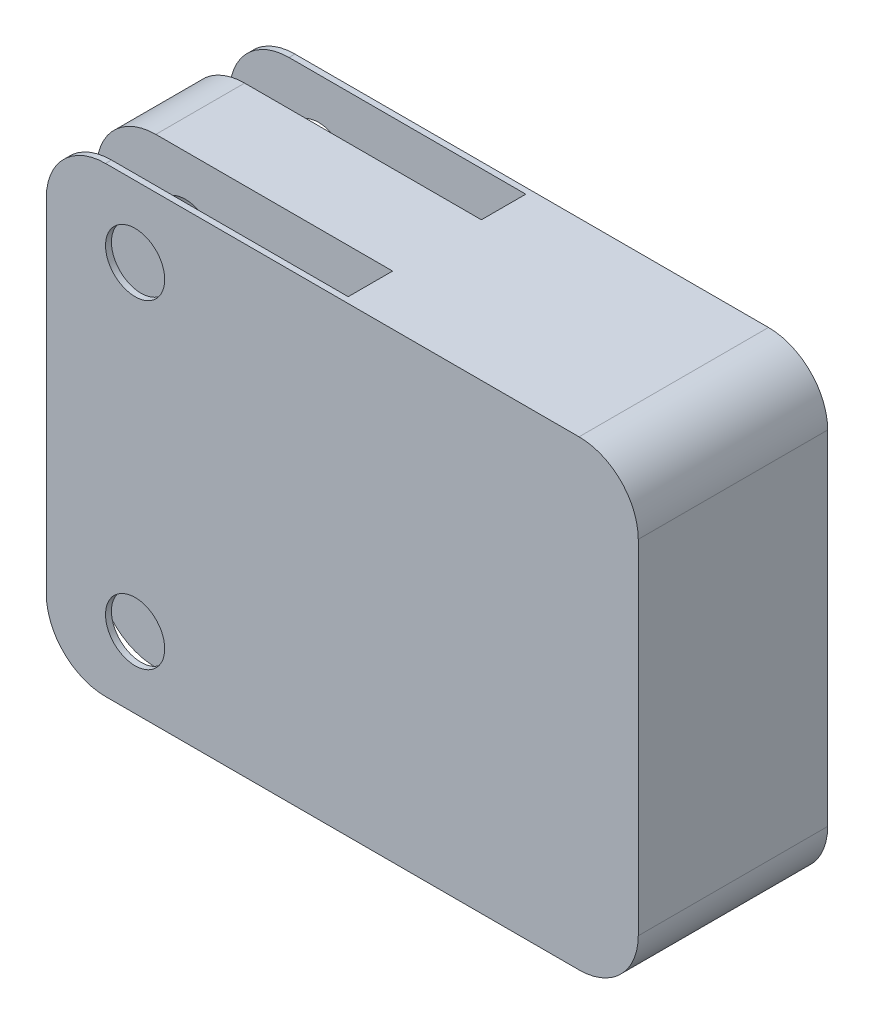
ISO-10303-21;
HEADER;
FILE_DESCRIPTION(('STEP AP214'),'2;1');
FILE_NAME('part.step','',(''),(''),'','','');
FILE_SCHEMA(('AUTOMOTIVE_DESIGN { 1 0 10303 214 1 1 1 1 }'));
ENDSEC;
DATA;
#1=APPLICATION_CONTEXT('core data for automotive mechanical design processes');
#2=APPLICATION_PROTOCOL_DEFINITION('international standard','automotive_design',2000,#1);
#3=PRODUCT_CONTEXT('',#1,'mechanical');
#4=PRODUCT('Part','Part','',(#3));
#5=PRODUCT_RELATED_PRODUCT_CATEGORY('part','',(#4));
#6=PRODUCT_DEFINITION_FORMATION('','',#4);
#7=PRODUCT_DEFINITION_CONTEXT('part definition',#1,'design');
#8=PRODUCT_DEFINITION('design','',#6,#7);
#9=PRODUCT_DEFINITION_SHAPE('','',#8);
#10=(LENGTH_UNIT() NAMED_UNIT(*) SI_UNIT(.MILLI.,.METRE.));
#11=(NAMED_UNIT(*) PLANE_ANGLE_UNIT() SI_UNIT($,.RADIAN.));
#12=(NAMED_UNIT(*) SI_UNIT($,.STERADIAN.) SOLID_ANGLE_UNIT());
#13=UNCERTAINTY_MEASURE_WITH_UNIT(LENGTH_MEASURE(1.E-05),#10,'distance_accuracy_value','');
#14=(GEOMETRIC_REPRESENTATION_CONTEXT(3) GLOBAL_UNCERTAINTY_ASSIGNED_CONTEXT((#13)) GLOBAL_UNIT_ASSIGNED_CONTEXT((#10,
#11,#12)) REPRESENTATION_CONTEXT('',''));
#15=CARTESIAN_POINT('',(0.,0.,0.));
#16=DIRECTION('',(0.,0.,1.));
#17=DIRECTION('',(1.,0.,0.));
#18=AXIS2_PLACEMENT_3D('',#15,#16,#17);
#19=CARTESIAN_POINT('',(0.,0.,15.));
#20=DIRECTION('',(0.,0.,1.));
#21=DIRECTION('',(1.,0.,0.));
#22=AXIS2_PLACEMENT_3D('',#19,#20,#21);
#23=PLANE('',#22);
#24=CARTESIAN_POINT('',(-40.,-27.,15.));
#25=DIRECTION('',(0.,0.,1.));
#26=DIRECTION('',(1.,0.,0.));
#27=AXIS2_PLACEMENT_3D('',#24,#25,#26);
#28=CIRCLE('',#27,5.);
#29=CARTESIAN_POINT('',(-35.,-27.,15.));
#30=VERTEX_POINT('',#29);
#31=EDGE_CURVE('E230',#30,#30,#28,.T.);
#32=ORIENTED_EDGE('',*,*,#31,.F.);
#33=EDGE_LOOP('',(#32));
#34=FACE_BOUND('',#33,.T.);
#35=CARTESIAN_POINT('',(-40.,27.,15.));
#36=DIRECTION('',(0.,0.,1.));
#37=DIRECTION('',(-1.,0.,0.));
#38=AXIS2_PLACEMENT_3D('',#35,#36,#37);
#39=CIRCLE('',#38,4.99999999999999);
#40=CARTESIAN_POINT('',(-45.,27.,15.));
#41=VERTEX_POINT('',#40);
#42=EDGE_CURVE('E222',#41,#41,#39,.T.);
#43=ORIENTED_EDGE('',*,*,#42,.F.);
#44=EDGE_LOOP('',(#43));
#45=FACE_BOUND('',#44,.T.);
#46=DIRECTION('',(1.,0.,0.));
#47=VECTOR('',#46,1.);
#48=CARTESIAN_POINT('',(45.,-39.,15.));
#49=LINE('',#48,#47);
#50=CARTESIAN_POINT('',(-45.,-39.,15.));
#51=VERTEX_POINT('',#50);
#52=CARTESIAN_POINT('',(-5.00000000000002,-39.,15.));
#53=VERTEX_POINT('',#52);
#54=EDGE_CURVE('E232',#51,#53,#49,.T.);
#55=ORIENTED_EDGE('',*,*,#54,.T.);
#56=DIRECTION('',(0.,1.,0.));
#57=VECTOR('',#56,1.);
#58=CARTESIAN_POINT('',(-5.00000000000002,39.,15.));
#59=LINE('',#58,#57);
#60=CARTESIAN_POINT('',(-5.00000000000002,39.,15.));
#61=VERTEX_POINT('',#60);
#62=EDGE_CURVE('E201',#53,#61,#59,.T.);
#63=ORIENTED_EDGE('',*,*,#62,.T.);
#64=DIRECTION('',(-1.,0.,0.));
#65=VECTOR('',#64,1.);
#66=CARTESIAN_POINT('',(45.,39.,15.));
#67=LINE('',#66,#65);
#68=CARTESIAN_POINT('',(-45.,39.,15.));
#69=VERTEX_POINT('',#68);
#70=EDGE_CURVE('E240',#61,#69,#67,.T.);
#71=ORIENTED_EDGE('',*,*,#70,.T.);
#72=CARTESIAN_POINT('',(-45.,29.,15.));
#73=DIRECTION('',(0.,0.,1.));
#74=DIRECTION('',(1.,0.,0.));
#75=AXIS2_PLACEMENT_3D('',#72,#73,#74);
#76=CIRCLE('',#75,10.);
#77=CARTESIAN_POINT('',(-55.,29.,15.));
#78=VERTEX_POINT('',#77);
#79=EDGE_CURVE('E265',#69,#78,#76,.T.);
#80=ORIENTED_EDGE('',*,*,#79,.T.);
#81=DIRECTION('',(0.,-1.,0.));
#82=VECTOR('',#81,1.);
#83=CARTESIAN_POINT('',(-55.,39.,15.));
#84=LINE('',#83,#82);
#85=CARTESIAN_POINT('',(-55.,-29.,15.));
#86=VERTEX_POINT('',#85);
#87=EDGE_CURVE('E239',#78,#86,#84,.T.);
#88=ORIENTED_EDGE('',*,*,#87,.T.);
#89=CARTESIAN_POINT('',(-45.,-29.,15.));
#90=DIRECTION('',(0.,0.,1.));
#91=DIRECTION('',(1.,0.,0.));
#92=AXIS2_PLACEMENT_3D('',#89,#90,#91);
#93=CIRCLE('',#92,10.);
#94=EDGE_CURVE('E262',#86,#51,#93,.T.);
#95=ORIENTED_EDGE('',*,*,#94,.T.);
#96=EDGE_LOOP('',(#55,#63,#71,#80,#88,#95));
#97=FACE_BOUND('',#96,.T.);
#98=ADVANCED_FACE('F39',(#34,#45,#97),#23,.T.);
#99=CARTESIAN_POINT('',(0.,0.,0.));
#100=DIRECTION('',(0.,0.,1.));
#101=DIRECTION('',(1.,0.,0.));
#102=AXIS2_PLACEMENT_3D('',#99,#100,#101);
#103=PLANE('',#102);
#104=DIRECTION('',(-1.,0.,0.));
#105=VECTOR('',#104,1.);
#106=CARTESIAN_POINT('',(45.,39.,0.));
#107=LINE('',#106,#105);
#108=CARTESIAN_POINT('',(-5.00000000000002,39.,0.));
#109=VERTEX_POINT('',#108);
#110=CARTESIAN_POINT('',(-45.,39.,0.));
#111=VERTEX_POINT('',#110);
#112=EDGE_CURVE('E246',#109,#111,#107,.T.);
#113=ORIENTED_EDGE('',*,*,#112,.F.);
#114=DIRECTION('',(0.,-1.,0.));
#115=VECTOR('',#114,1.);
#116=CARTESIAN_POINT('',(-5.00000000000002,-39.,0.));
#117=LINE('',#116,#115);
#118=CARTESIAN_POINT('',(-5.00000000000002,-39.,0.));
#119=VERTEX_POINT('',#118);
#120=EDGE_CURVE('E219',#109,#119,#117,.T.);
#121=ORIENTED_EDGE('',*,*,#120,.T.);
#122=DIRECTION('',(1.,0.,0.));
#123=VECTOR('',#122,1.);
#124=CARTESIAN_POINT('',(45.,-39.,0.));
#125=LINE('',#124,#123);
#126=CARTESIAN_POINT('',(-45.,-39.,0.));
#127=VERTEX_POINT('',#126);
#128=EDGE_CURVE('E235',#127,#119,#125,.T.);
#129=ORIENTED_EDGE('',*,*,#128,.F.);
#130=CARTESIAN_POINT('',(-45.,-29.,0.));
#131=DIRECTION('',(0.,0.,1.));
#132=DIRECTION('',(1.,0.,0.));
#133=AXIS2_PLACEMENT_3D('',#130,#131,#132);
#134=CIRCLE('',#133,10.);
#135=CARTESIAN_POINT('',(-55.,-29.,0.));
#136=VERTEX_POINT('',#135);
#137=EDGE_CURVE('E253',#127,#136,#134,.F.);
#138=ORIENTED_EDGE('',*,*,#137,.T.);
#139=DIRECTION('',(0.,-1.,0.));
#140=VECTOR('',#139,1.);
#141=CARTESIAN_POINT('',(-55.,39.,0.));
#142=LINE('',#141,#140);
#143=CARTESIAN_POINT('',(-55.,29.,0.));
#144=VERTEX_POINT('',#143);
#145=EDGE_CURVE('E238',#144,#136,#142,.T.);
#146=ORIENTED_EDGE('',*,*,#145,.F.);
#147=CARTESIAN_POINT('',(-45.,29.,0.));
#148=DIRECTION('',(0.,0.,1.));
#149=DIRECTION('',(1.,0.,0.));
#150=AXIS2_PLACEMENT_3D('',#147,#148,#149);
#151=CIRCLE('',#150,10.);
#152=EDGE_CURVE('E255',#144,#111,#151,.F.);
#153=ORIENTED_EDGE('',*,*,#152,.T.);
#154=EDGE_LOOP('',(#113,#121,#129,#138,#146,#153));
#155=FACE_BOUND('',#154,.T.);
#156=CARTESIAN_POINT('',(-40.,-27.,0.));
#157=DIRECTION('',(0.,0.,1.));
#158=DIRECTION('',(1.,0.,0.));
#159=AXIS2_PLACEMENT_3D('',#156,#157,#158);
#160=CIRCLE('',#159,5.);
#161=CARTESIAN_POINT('',(-35.,-27.,0.));
#162=VERTEX_POINT('',#161);
#163=EDGE_CURVE('E228',#162,#162,#160,.T.);
#164=ORIENTED_EDGE('',*,*,#163,.T.);
#165=EDGE_LOOP('',(#164));
#166=FACE_BOUND('',#165,.T.);
#167=CARTESIAN_POINT('',(-40.,27.,0.));
#168=DIRECTION('',(0.,0.,1.));
#169=DIRECTION('',(-1.,0.,0.));
#170=AXIS2_PLACEMENT_3D('',#167,#168,#169);
#171=CIRCLE('',#170,4.99999999999999);
#172=CARTESIAN_POINT('',(-45.,27.,0.));
#173=VERTEX_POINT('',#172);
#174=EDGE_CURVE('E205',#173,#173,#171,.T.);
#175=ORIENTED_EDGE('',*,*,#174,.T.);
#176=EDGE_LOOP('',(#175));
#177=FACE_BOUND('',#176,.T.);
#178=ADVANCED_FACE('F395',(#155,#166,#177),#103,.F.);
#179=CARTESIAN_POINT('',(45.,-39.,15.));
#180=DIRECTION('',(0.,1.,0.));
#181=DIRECTION('',(0.,0.,1.));
#182=AXIS2_PLACEMENT_3D('',#179,#180,#181);
#183=PLANE('',#182);
#184=DIRECTION('',(1.,0.,0.));
#185=VECTOR('',#184,1.);
#186=CARTESIAN_POINT('',(-55.,-39.,23.5));
#187=LINE('',#186,#185);
#188=CARTESIAN_POINT('',(-45.,-39.,23.5));
#189=VERTEX_POINT('',#188);
#190=CARTESIAN_POINT('',(35.,-39.,23.5));
#191=VERTEX_POINT('',#190);
#192=EDGE_CURVE('E194',#189,#191,#187,.T.);
#193=ORIENTED_EDGE('',*,*,#192,.F.);
#194=DIRECTION('',(0.,0.,-1.));
#195=VECTOR('',#194,1.);
#196=CARTESIAN_POINT('',(-45.,-39.,22.5));
#197=LINE('',#196,#195);
#198=CARTESIAN_POINT('',(-45.,-39.,22.5));
#199=VERTEX_POINT('',#198);
#200=EDGE_CURVE('E186',#189,#199,#197,.T.);
#201=ORIENTED_EDGE('',*,*,#200,.T.);
#202=DIRECTION('',(1.,0.,0.));
#203=VECTOR('',#202,1.);
#204=CARTESIAN_POINT('',(-55.,-39.,22.5));
#205=LINE('',#204,#203);
#206=CARTESIAN_POINT('',(-5.00000000000002,-39.,22.5));
#207=VERTEX_POINT('',#206);
#208=EDGE_CURVE('E181',#199,#207,#205,.T.);
#209=ORIENTED_EDGE('',*,*,#208,.T.);
#210=DIRECTION('',(0.,0.,-1.));
#211=VECTOR('',#210,1.);
#212=CARTESIAN_POINT('',(-5.00000000000002,-39.,15.));
#213=LINE('',#212,#211);
#214=EDGE_CURVE('E187',#207,#53,#213,.T.);
#215=ORIENTED_EDGE('',*,*,#214,.T.);
#216=ORIENTED_EDGE('',*,*,#54,.F.);
#217=DIRECTION('',(0.,0.,-1.));
#218=VECTOR('',#217,1.);
#219=CARTESIAN_POINT('',(-45.,-39.,15.));
#220=LINE('',#219,#218);
#221=EDGE_CURVE('E243',#51,#127,#220,.T.);
#222=ORIENTED_EDGE('',*,*,#221,.T.);
#223=ORIENTED_EDGE('',*,*,#128,.T.);
#224=DIRECTION('',(0.,0.,-1.));
#225=VECTOR('',#224,1.);
#226=CARTESIAN_POINT('',(-5.00000000000002,-39.,0.));
#227=LINE('',#226,#225);
#228=CARTESIAN_POINT('',(-5.00000000000002,-39.,-7.5));
#229=VERTEX_POINT('',#228);
#230=EDGE_CURVE('E220',#119,#229,#227,.T.);
#231=ORIENTED_EDGE('',*,*,#230,.T.);
#232=DIRECTION('',(1.,0.,0.));
#233=VECTOR('',#232,1.);
#234=CARTESIAN_POINT('',(-55.,-39.,-7.5));
#235=LINE('',#234,#233);
#236=CARTESIAN_POINT('',(-45.,-39.,-7.5));
#237=VERTEX_POINT('',#236);
#238=EDGE_CURVE('E354',#237,#229,#235,.T.);
#239=ORIENTED_EDGE('',*,*,#238,.F.);
#240=DIRECTION('',(0.,0.,-1.));
#241=VECTOR('',#240,1.);
#242=CARTESIAN_POINT('',(-45.,-39.,15.));
#243=LINE('',#242,#241);
#244=CARTESIAN_POINT('',(-45.,-39.,-8.5));
#245=VERTEX_POINT('',#244);
#246=EDGE_CURVE('E298',#237,#245,#243,.T.);
#247=ORIENTED_EDGE('',*,*,#246,.T.);
#248=DIRECTION('',(1.,0.,0.));
#249=VECTOR('',#248,1.);
#250=CARTESIAN_POINT('',(-55.,-39.,-8.5));
#251=LINE('',#250,#249);
#252=CARTESIAN_POINT('',(35.,-39.,-8.5));
#253=VERTEX_POINT('',#252);
#254=EDGE_CURVE('E356',#245,#253,#251,.T.);
#255=ORIENTED_EDGE('',*,*,#254,.T.);
#256=DIRECTION('',(0.,0.,-1.));
#257=VECTOR('',#256,1.);
#258=CARTESIAN_POINT('',(35.,-39.,15.));
#259=LINE('',#258,#257);
#260=EDGE_CURVE('E291',#253,#191,#259,.F.);
#261=ORIENTED_EDGE('',*,*,#260,.T.);
#262=EDGE_LOOP('',(#193,#201,#209,#215,#216,#222,#223,#231,#239,#247,#255,#261));
#263=FACE_BOUND('',#262,.T.);
#264=ADVANCED_FACE('F183',(#263),#183,.F.);
#265=CARTESIAN_POINT('',(45.,39.,15.));
#266=DIRECTION('',(-1.,0.,0.));
#267=DIRECTION('',(0.,0.,1.));
#268=AXIS2_PLACEMENT_3D('',#265,#266,#267);
#269=PLANE('',#268);
#270=DIRECTION('',(0.,1.,0.));
#271=VECTOR('',#270,1.);
#272=CARTESIAN_POINT('',(45.,-39.,-8.5));
#273=LINE('',#272,#271);
#274=CARTESIAN_POINT('',(45.,-29.,-8.5));
#275=VERTEX_POINT('',#274);
#276=CARTESIAN_POINT('',(45.,29.,-8.5));
#277=VERTEX_POINT('',#276);
#278=EDGE_CURVE('E347',#275,#277,#273,.T.);
#279=ORIENTED_EDGE('',*,*,#278,.T.);
#280=DIRECTION('',(0.,0.,-1.));
#281=VECTOR('',#280,1.);
#282=CARTESIAN_POINT('',(45.,29.,15.));
#283=LINE('',#282,#281);
#284=CARTESIAN_POINT('',(45.,29.,23.5));
#285=VERTEX_POINT('',#284);
#286=EDGE_CURVE('E286',#277,#285,#283,.F.);
#287=ORIENTED_EDGE('',*,*,#286,.T.);
#288=DIRECTION('',(0.,-1.,0.));
#289=VECTOR('',#288,1.);
#290=CARTESIAN_POINT('',(45.,-39.,23.5));
#291=LINE('',#290,#289);
#292=CARTESIAN_POINT('',(45.,-29.,23.5));
#293=VERTEX_POINT('',#292);
#294=EDGE_CURVE('E348',#285,#293,#291,.T.);
#295=ORIENTED_EDGE('',*,*,#294,.T.);
#296=DIRECTION('',(0.,0.,-1.));
#297=VECTOR('',#296,1.);
#298=CARTESIAN_POINT('',(45.,-29.,15.));
#299=LINE('',#298,#297);
#300=EDGE_CURVE('E281',#293,#275,#299,.T.);
#301=ORIENTED_EDGE('',*,*,#300,.T.);
#302=EDGE_LOOP('',(#279,#287,#295,#301));
#303=FACE_BOUND('',#302,.T.);
#304=ADVANCED_FACE('F426',(#303),#269,.F.);
#305=CARTESIAN_POINT('',(45.,39.,15.));
#306=DIRECTION('',(0.,-1.,0.));
#307=DIRECTION('',(1.,0.,0.));
#308=AXIS2_PLACEMENT_3D('',#305,#306,#307);
#309=PLANE('',#308);
#310=DIRECTION('',(1.,0.,0.));
#311=VECTOR('',#310,1.);
#312=CARTESIAN_POINT('',(-55.,39.,22.5));
#313=LINE('',#312,#311);
#314=CARTESIAN_POINT('',(-45.,39.,22.5));
#315=VERTEX_POINT('',#314);
#316=CARTESIAN_POINT('',(-5.00000000000002,39.,22.5));
#317=VERTEX_POINT('',#316);
#318=EDGE_CURVE('E207',#315,#317,#313,.T.);
#319=ORIENTED_EDGE('',*,*,#318,.F.);
#320=DIRECTION('',(0.,0.,1.));
#321=VECTOR('',#320,1.);
#322=CARTESIAN_POINT('',(-45.,39.,23.5));
#323=LINE('',#322,#321);
#324=CARTESIAN_POINT('',(-45.,39.,23.5));
#325=VERTEX_POINT('',#324);
#326=EDGE_CURVE('E11',#315,#325,#323,.T.);
#327=ORIENTED_EDGE('',*,*,#326,.T.);
#328=DIRECTION('',(1.,0.,0.));
#329=VECTOR('',#328,1.);
#330=CARTESIAN_POINT('',(-55.,39.,23.5));
#331=LINE('',#330,#329);
#332=CARTESIAN_POINT('',(35.,39.,23.5));
#333=VERTEX_POINT('',#332);
#334=EDGE_CURVE('E355',#325,#333,#331,.T.);
#335=ORIENTED_EDGE('',*,*,#334,.T.);
#336=DIRECTION('',(0.,0.,-1.));
#337=VECTOR('',#336,1.);
#338=CARTESIAN_POINT('',(35.,39.,15.));
#339=LINE('',#338,#337);
#340=CARTESIAN_POINT('',(35.,39.,-8.5));
#341=VERTEX_POINT('',#340);
#342=EDGE_CURVE('E275',#333,#341,#339,.T.);
#343=ORIENTED_EDGE('',*,*,#342,.T.);
#344=DIRECTION('',(1.,0.,0.));
#345=VECTOR('',#344,1.);
#346=CARTESIAN_POINT('',(-55.,39.,-8.5));
#347=LINE('',#346,#345);
#348=CARTESIAN_POINT('',(-45.,39.,-8.5));
#349=VERTEX_POINT('',#348);
#350=EDGE_CURVE('E363',#349,#341,#347,.T.);
#351=ORIENTED_EDGE('',*,*,#350,.F.);
#352=DIRECTION('',(0.,0.,1.));
#353=VECTOR('',#352,1.);
#354=CARTESIAN_POINT('',(-45.,39.,15.));
#355=LINE('',#354,#353);
#356=CARTESIAN_POINT('',(-45.,39.,-7.5));
#357=VERTEX_POINT('',#356);
#358=EDGE_CURVE('E268',#349,#357,#355,.T.);
#359=ORIENTED_EDGE('',*,*,#358,.T.);
#360=DIRECTION('',(1.,0.,0.));
#361=VECTOR('',#360,1.);
#362=CARTESIAN_POINT('',(-55.,39.,-7.5));
#363=LINE('',#362,#361);
#364=CARTESIAN_POINT('',(-5.00000000000002,39.,-7.5));
#365=VERTEX_POINT('',#364);
#366=EDGE_CURVE('E342',#357,#365,#363,.T.);
#367=ORIENTED_EDGE('',*,*,#366,.T.);
#368=DIRECTION('',(0.,0.,1.));
#369=VECTOR('',#368,1.);
#370=CARTESIAN_POINT('',(-5.00000000000002,39.,-7.5));
#371=LINE('',#370,#369);
#372=EDGE_CURVE('E195',#365,#109,#371,.T.);
#373=ORIENTED_EDGE('',*,*,#372,.T.);
#374=ORIENTED_EDGE('',*,*,#112,.T.);
#375=DIRECTION('',(0.,0.,-1.));
#376=VECTOR('',#375,1.);
#377=CARTESIAN_POINT('',(-45.,39.,15.));
#378=LINE('',#377,#376);
#379=EDGE_CURVE('E266',#111,#69,#378,.F.);
#380=ORIENTED_EDGE('',*,*,#379,.T.);
#381=ORIENTED_EDGE('',*,*,#70,.F.);
#382=DIRECTION('',(0.,0.,1.));
#383=VECTOR('',#382,1.);
#384=CARTESIAN_POINT('',(-5.00000000000002,39.,22.5));
#385=LINE('',#384,#383);
#386=EDGE_CURVE('E210',#61,#317,#385,.T.);
#387=ORIENTED_EDGE('',*,*,#386,.T.);
#388=EDGE_LOOP('',(#319,#327,#335,#343,#351,#359,#367,#373,#374,#380,#381,#387));
#389=FACE_BOUND('',#388,.T.);
#390=ADVANCED_FACE('F372',(#389),#309,.F.);
#391=CARTESIAN_POINT('',(-55.,39.,15.));
#392=DIRECTION('',(1.,0.,0.));
#393=DIRECTION('',(0.,0.,-1.));
#394=AXIS2_PLACEMENT_3D('',#391,#392,#393);
#395=PLANE('',#394);
#396=ORIENTED_EDGE('',*,*,#145,.T.);
#397=DIRECTION('',(0.,0.,-1.));
#398=VECTOR('',#397,1.);
#399=CARTESIAN_POINT('',(-55.,-29.,15.));
#400=LINE('',#399,#398);
#401=EDGE_CURVE('E258',#136,#86,#400,.F.);
#402=ORIENTED_EDGE('',*,*,#401,.T.);
#403=ORIENTED_EDGE('',*,*,#87,.F.);
#404=DIRECTION('',(0.,0.,-1.));
#405=VECTOR('',#404,1.);
#406=CARTESIAN_POINT('',(-55.,29.,15.));
#407=LINE('',#406,#405);
#408=EDGE_CURVE('E260',#78,#144,#407,.T.);
#409=ORIENTED_EDGE('',*,*,#408,.T.);
#410=EDGE_LOOP('',(#396,#402,#403,#409));
#411=FACE_BOUND('',#410,.T.);
#412=ADVANCED_FACE('F381',(#411),#395,.F.);
#413=CARTESIAN_POINT('',(-40.,-27.,15.));
#414=DIRECTION('',(0.,0.,-1.));
#415=DIRECTION('',(-1.,0.,0.));
#416=AXIS2_PLACEMENT_3D('',#413,#414,#415);
#417=CYLINDRICAL_SURFACE('',#416,5.);
#418=ORIENTED_EDGE('',*,*,#31,.T.);
#419=EDGE_LOOP('',(#418));
#420=FACE_BOUND('',#419,.T.);
#421=ORIENTED_EDGE('',*,*,#163,.F.);
#422=EDGE_LOOP('',(#421));
#423=FACE_BOUND('',#422,.T.);
#424=ADVANCED_FACE('F464',(#420,#423),#417,.F.);
#425=CARTESIAN_POINT('',(-40.,27.,15.));
#426=DIRECTION('',(0.,0.,-1.));
#427=DIRECTION('',(-1.,0.,0.));
#428=AXIS2_PLACEMENT_3D('',#425,#426,#427);
#429=CYLINDRICAL_SURFACE('',#428,4.99999999999999);
#430=ORIENTED_EDGE('',*,*,#42,.T.);
#431=EDGE_LOOP('',(#430));
#432=FACE_BOUND('',#431,.T.);
#433=ORIENTED_EDGE('',*,*,#174,.F.);
#434=EDGE_LOOP('',(#433));
#435=FACE_BOUND('',#434,.T.);
#436=ADVANCED_FACE('F476',(#432,#435),#429,.F.);
#437=CARTESIAN_POINT('',(-45.,-29.,15.));
#438=DIRECTION('',(0.,0.,-1.));
#439=DIRECTION('',(-1.,0.,0.));
#440=AXIS2_PLACEMENT_3D('',#437,#438,#439);
#441=CYLINDRICAL_SURFACE('',#440,10.);
#442=ORIENTED_EDGE('',*,*,#94,.F.);
#443=ORIENTED_EDGE('',*,*,#401,.F.);
#444=ORIENTED_EDGE('',*,*,#137,.F.);
#445=ORIENTED_EDGE('',*,*,#221,.F.);
#446=EDGE_LOOP('',(#442,#443,#444,#445));
#447=FACE_BOUND('',#446,.T.);
#448=ADVANCED_FACE('F389',(#447),#441,.T.);
#449=CARTESIAN_POINT('',(-45.,29.,15.));
#450=DIRECTION('',(0.,0.,-1.));
#451=DIRECTION('',(-1.,0.,0.));
#452=AXIS2_PLACEMENT_3D('',#449,#450,#451);
#453=CYLINDRICAL_SURFACE('',#452,10.);
#454=ORIENTED_EDGE('',*,*,#79,.F.);
#455=ORIENTED_EDGE('',*,*,#379,.F.);
#456=ORIENTED_EDGE('',*,*,#152,.F.);
#457=ORIENTED_EDGE('',*,*,#408,.F.);
#458=EDGE_LOOP('',(#454,#455,#456,#457));
#459=FACE_BOUND('',#458,.T.);
#460=ADVANCED_FACE('F379',(#459),#453,.T.);
#461=CARTESIAN_POINT('',(-5.00000000000002,0.,0.));
#462=DIRECTION('',(1.,0.,0.));
#463=DIRECTION('',(0.,0.,-1.));
#464=AXIS2_PLACEMENT_3D('',#461,#462,#463);
#465=PLANE('',#464);
#466=ORIENTED_EDGE('',*,*,#120,.F.);
#467=ORIENTED_EDGE('',*,*,#372,.F.);
#468=DIRECTION('',(0.,1.,0.));
#469=VECTOR('',#468,1.);
#470=CARTESIAN_POINT('',(-5.00000000000002,-39.,-7.5));
#471=LINE('',#470,#469);
#472=EDGE_CURVE('E211',#229,#365,#471,.T.);
#473=ORIENTED_EDGE('',*,*,#472,.F.);
#474=ORIENTED_EDGE('',*,*,#230,.F.);
#475=EDGE_LOOP('',(#466,#467,#473,#474));
#476=FACE_BOUND('',#475,.T.);
#477=ADVANCED_FACE('F396',(#476),#465,.F.);
#478=CARTESIAN_POINT('',(-5.00000000000002,0.,0.));
#479=DIRECTION('',(-1.,0.,0.));
#480=DIRECTION('',(0.,0.,1.));
#481=AXIS2_PLACEMENT_3D('',#478,#479,#480);
#482=PLANE('',#481);
#483=ORIENTED_EDGE('',*,*,#62,.F.);
#484=ORIENTED_EDGE('',*,*,#214,.F.);
#485=DIRECTION('',(0.,-1.,0.));
#486=VECTOR('',#485,1.);
#487=CARTESIAN_POINT('',(-5.00000000000002,-39.,22.5));
#488=LINE('',#487,#486);
#489=EDGE_CURVE('E196',#317,#207,#488,.T.);
#490=ORIENTED_EDGE('',*,*,#489,.F.);
#491=ORIENTED_EDGE('',*,*,#386,.F.);
#492=EDGE_LOOP('',(#483,#484,#490,#491));
#493=FACE_BOUND('',#492,.T.);
#494=ADVANCED_FACE('F200',(#493),#482,.T.);
#495=CARTESIAN_POINT('',(-55.,39.,22.5));
#496=DIRECTION('',(0.,0.,-1.));
#497=DIRECTION('',(-1.,0.,0.));
#498=AXIS2_PLACEMENT_3D('',#495,#496,#497);
#499=PLANE('',#498);
#500=CARTESIAN_POINT('',(-40.,27.,22.5));
#501=DIRECTION('',(0.,0.,-1.));
#502=DIRECTION('',(-1.,0.,0.));
#503=AXIS2_PLACEMENT_3D('',#500,#501,#502);
#504=CIRCLE('',#503,4.99999999999999);
#505=CARTESIAN_POINT('',(-45.,27.,22.5));
#506=VERTEX_POINT('',#505);
#507=EDGE_CURVE('E336',#506,#506,#504,.T.);
#508=ORIENTED_EDGE('',*,*,#507,.F.);
#509=EDGE_LOOP('',(#508));
#510=FACE_BOUND('',#509,.T.);
#511=CARTESIAN_POINT('',(-40.,-27.,22.5));
#512=DIRECTION('',(0.,0.,-1.));
#513=DIRECTION('',(-1.,0.,0.));
#514=AXIS2_PLACEMENT_3D('',#511,#512,#513);
#515=CIRCLE('',#514,5.);
#516=CARTESIAN_POINT('',(-45.,-27.,22.5));
#517=VERTEX_POINT('',#516);
#518=EDGE_CURVE('E324',#517,#517,#515,.T.);
#519=ORIENTED_EDGE('',*,*,#518,.F.);
#520=EDGE_LOOP('',(#519));
#521=FACE_BOUND('',#520,.T.);
#522=ORIENTED_EDGE('',*,*,#208,.F.);
#523=CARTESIAN_POINT('',(-45.,-29.,22.5));
#524=DIRECTION('',(0.,0.,-1.));
#525=DIRECTION('',(-1.,0.,0.));
#526=AXIS2_PLACEMENT_3D('',#523,#524,#525);
#527=CIRCLE('',#526,10.);
#528=CARTESIAN_POINT('',(-55.,-29.,22.5));
#529=VERTEX_POINT('',#528);
#530=EDGE_CURVE('E309',#199,#529,#527,.T.);
#531=ORIENTED_EDGE('',*,*,#530,.T.);
#532=DIRECTION('',(0.,1.,0.));
#533=VECTOR('',#532,1.);
#534=CARTESIAN_POINT('',(-55.,39.,22.5));
#535=LINE('',#534,#533);
#536=CARTESIAN_POINT('',(-55.,29.,22.5));
#537=VERTEX_POINT('',#536);
#538=EDGE_CURVE('E345',#529,#537,#535,.T.);
#539=ORIENTED_EDGE('',*,*,#538,.T.);
#540=CARTESIAN_POINT('',(-45.,29.,22.5));
#541=DIRECTION('',(0.,0.,-1.));
#542=DIRECTION('',(-1.,0.,0.));
#543=AXIS2_PLACEMENT_3D('',#540,#541,#542);
#544=CIRCLE('',#543,10.);
#545=EDGE_CURVE('E308',#537,#315,#544,.T.);
#546=ORIENTED_EDGE('',*,*,#545,.T.);
#547=ORIENTED_EDGE('',*,*,#318,.T.);
#548=ORIENTED_EDGE('',*,*,#489,.T.);
#549=EDGE_LOOP('',(#522,#531,#539,#546,#547,#548));
#550=FACE_BOUND('',#549,.T.);
#551=ADVANCED_FACE('F203',(#510,#521,#550),#499,.T.);
#552=CARTESIAN_POINT('',(-55.,-39.,23.5));
#553=DIRECTION('',(0.,0.,1.));
#554=DIRECTION('',(1.,0.,0.));
#555=AXIS2_PLACEMENT_3D('',#552,#553,#554);
#556=PLANE('',#555);
#557=CARTESIAN_POINT('',(-40.,27.,23.5));
#558=DIRECTION('',(0.,0.,1.));
#559=DIRECTION('',(1.,0.,0.));
#560=AXIS2_PLACEMENT_3D('',#557,#558,#559);
#561=CIRCLE('',#560,4.99999999999999);
#562=CARTESIAN_POINT('',(-35.,27.,23.5));
#563=VERTEX_POINT('',#562);
#564=EDGE_CURVE('E316',#563,#563,#561,.T.);
#565=ORIENTED_EDGE('',*,*,#564,.F.);
#566=EDGE_LOOP('',(#565));
#567=FACE_BOUND('',#566,.T.);
#568=CARTESIAN_POINT('',(-40.,-27.,23.5));
#569=DIRECTION('',(0.,0.,1.));
#570=DIRECTION('',(1.,0.,0.));
#571=AXIS2_PLACEMENT_3D('',#568,#569,#570);
#572=CIRCLE('',#571,5.);
#573=CARTESIAN_POINT('',(-35.,-27.,23.5));
#574=VERTEX_POINT('',#573);
#575=EDGE_CURVE('E328',#574,#574,#572,.T.);
#576=ORIENTED_EDGE('',*,*,#575,.F.);
#577=EDGE_LOOP('',(#576));
#578=FACE_BOUND('',#577,.T.);
#579=DIRECTION('',(0.,-1.,0.));
#580=VECTOR('',#579,1.);
#581=CARTESIAN_POINT('',(-55.,-39.,23.5));
#582=LINE('',#581,#580);
#583=CARTESIAN_POINT('',(-55.,29.,23.5));
#584=VERTEX_POINT('',#583);
#585=CARTESIAN_POINT('',(-55.,-29.,23.5));
#586=VERTEX_POINT('',#585);
#587=EDGE_CURVE('E343',#584,#586,#582,.T.);
#588=ORIENTED_EDGE('',*,*,#587,.T.);
#589=CARTESIAN_POINT('',(-45.,-29.,23.5));
#590=DIRECTION('',(0.,0.,1.));
#591=DIRECTION('',(1.,0.,0.));
#592=AXIS2_PLACEMENT_3D('',#589,#590,#591);
#593=CIRCLE('',#592,10.);
#594=EDGE_CURVE('E48',#586,#189,#593,.T.);
#595=ORIENTED_EDGE('',*,*,#594,.T.);
#596=ORIENTED_EDGE('',*,*,#192,.T.);
#597=CARTESIAN_POINT('',(35.,-29.,23.5));
#598=DIRECTION('',(0.,0.,1.));
#599=DIRECTION('',(1.,0.,0.));
#600=AXIS2_PLACEMENT_3D('',#597,#598,#599);
#601=CIRCLE('',#600,10.);
#602=EDGE_CURVE('E287',#191,#293,#601,.T.);
#603=ORIENTED_EDGE('',*,*,#602,.T.);
#604=ORIENTED_EDGE('',*,*,#294,.F.);
#605=CARTESIAN_POINT('',(35.,29.,23.5));
#606=DIRECTION('',(0.,0.,1.));
#607=DIRECTION('',(1.,0.,0.));
#608=AXIS2_PLACEMENT_3D('',#605,#606,#607);
#609=CIRCLE('',#608,10.);
#610=EDGE_CURVE('E289',#285,#333,#609,.T.);
#611=ORIENTED_EDGE('',*,*,#610,.T.);
#612=ORIENTED_EDGE('',*,*,#334,.F.);
#613=CARTESIAN_POINT('',(-45.,29.,23.5));
#614=DIRECTION('',(0.,0.,1.));
#615=DIRECTION('',(1.,0.,0.));
#616=AXIS2_PLACEMENT_3D('',#613,#614,#615);
#617=CIRCLE('',#616,10.);
#618=EDGE_CURVE('E57',#325,#584,#617,.T.);
#619=ORIENTED_EDGE('',*,*,#618,.T.);
#620=EDGE_LOOP('',(#588,#595,#596,#603,#604,#611,#612,#619));
#621=FACE_BOUND('',#620,.T.);
#622=ADVANCED_FACE('F441',(#567,#578,#621),#556,.T.);
#623=CARTESIAN_POINT('',(-55.,0.,0.));
#624=DIRECTION('',(-1.,0.,0.));
#625=DIRECTION('',(0.,0.,1.));
#626=AXIS2_PLACEMENT_3D('',#623,#624,#625);
#627=PLANE('',#626);
#628=ORIENTED_EDGE('',*,*,#538,.F.);
#629=DIRECTION('',(0.,0.,-1.));
#630=VECTOR('',#629,1.);
#631=CARTESIAN_POINT('',(-55.,-29.,23.5));
#632=LINE('',#631,#630);
#633=EDGE_CURVE('E64',#529,#586,#632,.F.);
#634=ORIENTED_EDGE('',*,*,#633,.T.);
#635=ORIENTED_EDGE('',*,*,#587,.F.);
#636=DIRECTION('',(0.,0.,1.));
#637=VECTOR('',#636,1.);
#638=CARTESIAN_POINT('',(-55.,29.,22.5));
#639=LINE('',#638,#637);
#640=EDGE_CURVE('E315',#584,#537,#639,.F.);
#641=ORIENTED_EDGE('',*,*,#640,.T.);
#642=EDGE_LOOP('',(#628,#634,#635,#641));
#643=FACE_BOUND('',#642,.T.);
#644=ADVANCED_FACE('F439',(#643),#627,.T.);
#645=CARTESIAN_POINT('',(-55.,39.,-7.5));
#646=DIRECTION('',(0.,0.,1.));
#647=DIRECTION('',(1.,0.,0.));
#648=AXIS2_PLACEMENT_3D('',#645,#646,#647);
#649=PLANE('',#648);
#650=CARTESIAN_POINT('',(-40.,27.,-7.50000000000001));
#651=DIRECTION('',(0.,0.,1.));
#652=DIRECTION('',(1.,0.,0.));
#653=AXIS2_PLACEMENT_3D('',#650,#651,#652);
#654=CIRCLE('',#653,4.99999999999999);
#655=CARTESIAN_POINT('',(-35.,27.,-7.50000000000001));
#656=VERTEX_POINT('',#655);
#657=EDGE_CURVE('E334',#656,#656,#654,.T.);
#658=ORIENTED_EDGE('',*,*,#657,.F.);
#659=EDGE_LOOP('',(#658));
#660=FACE_BOUND('',#659,.T.);
#661=CARTESIAN_POINT('',(-40.,-27.,-7.50000000000001));
#662=DIRECTION('',(0.,0.,1.));
#663=DIRECTION('',(1.,0.,0.));
#664=AXIS2_PLACEMENT_3D('',#661,#662,#663);
#665=CIRCLE('',#664,5.);
#666=CARTESIAN_POINT('',(-35.,-27.,-7.50000000000001));
#667=VERTEX_POINT('',#666);
#668=EDGE_CURVE('E319',#667,#667,#665,.T.);
#669=ORIENTED_EDGE('',*,*,#668,.F.);
#670=EDGE_LOOP('',(#669));
#671=FACE_BOUND('',#670,.T.);
#672=DIRECTION('',(0.,-1.,0.));
#673=VECTOR('',#672,1.);
#674=CARTESIAN_POINT('',(-55.,39.,-7.5));
#675=LINE('',#674,#673);
#676=CARTESIAN_POINT('',(-55.,29.,-7.5));
#677=VERTEX_POINT('',#676);
#678=CARTESIAN_POINT('',(-55.,-29.,-7.5));
#679=VERTEX_POINT('',#678);
#680=EDGE_CURVE('E370',#677,#679,#675,.T.);
#681=ORIENTED_EDGE('',*,*,#680,.T.);
#682=CARTESIAN_POINT('',(-45.,-29.,-7.5));
#683=DIRECTION('',(0.,0.,1.));
#684=DIRECTION('',(1.,0.,0.));
#685=AXIS2_PLACEMENT_3D('',#682,#683,#684);
#686=CIRCLE('',#685,10.);
#687=EDGE_CURVE('E304',#679,#237,#686,.T.);
#688=ORIENTED_EDGE('',*,*,#687,.T.);
#689=ORIENTED_EDGE('',*,*,#238,.T.);
#690=ORIENTED_EDGE('',*,*,#472,.T.);
#691=ORIENTED_EDGE('',*,*,#366,.F.);
#692=CARTESIAN_POINT('',(-45.,29.,-7.5));
#693=DIRECTION('',(0.,0.,1.));
#694=DIRECTION('',(1.,0.,0.));
#695=AXIS2_PLACEMENT_3D('',#692,#693,#694);
#696=CIRCLE('',#695,10.);
#697=EDGE_CURVE('E303',#357,#677,#696,.T.);
#698=ORIENTED_EDGE('',*,*,#697,.T.);
#699=EDGE_LOOP('',(#681,#688,#689,#690,#691,#698));
#700=FACE_BOUND('',#699,.T.);
#701=ADVANCED_FACE('F405',(#660,#671,#700),#649,.T.);
#702=CARTESIAN_POINT('',(-55.,-39.,-8.5));
#703=DIRECTION('',(0.,0.,-1.));
#704=DIRECTION('',(-1.,0.,0.));
#705=AXIS2_PLACEMENT_3D('',#702,#703,#704);
#706=PLANE('',#705);
#707=CARTESIAN_POINT('',(-40.,27.,-8.50000000000001));
#708=DIRECTION('',(0.,0.,-1.));
#709=DIRECTION('',(-1.,0.,0.));
#710=AXIS2_PLACEMENT_3D('',#707,#708,#709);
#711=CIRCLE('',#710,4.99999999999999);
#712=CARTESIAN_POINT('',(-45.,27.,-8.50000000000001));
#713=VERTEX_POINT('',#712);
#714=EDGE_CURVE('E43',#713,#713,#711,.T.);
#715=ORIENTED_EDGE('',*,*,#714,.F.);
#716=EDGE_LOOP('',(#715));
#717=FACE_BOUND('',#716,.T.);
#718=CARTESIAN_POINT('',(-40.,-27.,-8.50000000000001));
#719=DIRECTION('',(0.,0.,-1.));
#720=DIRECTION('',(-1.,0.,0.));
#721=AXIS2_PLACEMENT_3D('',#718,#719,#720);
#722=CIRCLE('',#721,5.);
#723=CARTESIAN_POINT('',(-45.,-27.,-8.50000000000001));
#724=VERTEX_POINT('',#723);
#725=EDGE_CURVE('E317',#724,#724,#722,.T.);
#726=ORIENTED_EDGE('',*,*,#725,.F.);
#727=EDGE_LOOP('',(#726));
#728=FACE_BOUND('',#727,.T.);
#729=ORIENTED_EDGE('',*,*,#350,.T.);
#730=CARTESIAN_POINT('',(35.,29.,-8.5));
#731=DIRECTION('',(0.,0.,-1.));
#732=DIRECTION('',(-1.,0.,0.));
#733=AXIS2_PLACEMENT_3D('',#730,#731,#732);
#734=CIRCLE('',#733,10.);
#735=EDGE_CURVE('E283',#341,#277,#734,.T.);
#736=ORIENTED_EDGE('',*,*,#735,.T.);
#737=ORIENTED_EDGE('',*,*,#278,.F.);
#738=CARTESIAN_POINT('',(35.,-29.,-8.5));
#739=DIRECTION('',(0.,0.,-1.));
#740=DIRECTION('',(-1.,0.,0.));
#741=AXIS2_PLACEMENT_3D('',#738,#739,#740);
#742=CIRCLE('',#741,10.);
#743=EDGE_CURVE('E280',#275,#253,#742,.T.);
#744=ORIENTED_EDGE('',*,*,#743,.T.);
#745=ORIENTED_EDGE('',*,*,#254,.F.);
#746=CARTESIAN_POINT('',(-45.,-29.,-8.5));
#747=DIRECTION('',(0.,0.,-1.));
#748=DIRECTION('',(-1.,0.,0.));
#749=AXIS2_PLACEMENT_3D('',#746,#747,#748);
#750=CIRCLE('',#749,10.);
#751=CARTESIAN_POINT('',(-55.,-29.,-8.5));
#752=VERTEX_POINT('',#751);
#753=EDGE_CURVE('E276',#245,#752,#750,.T.);
#754=ORIENTED_EDGE('',*,*,#753,.T.);
#755=DIRECTION('',(0.,1.,0.));
#756=VECTOR('',#755,1.);
#757=CARTESIAN_POINT('',(-55.,-39.,-8.5));
#758=LINE('',#757,#756);
#759=CARTESIAN_POINT('',(-55.,29.,-8.5));
#760=VERTEX_POINT('',#759);
#761=EDGE_CURVE('E357',#752,#760,#758,.T.);
#762=ORIENTED_EDGE('',*,*,#761,.T.);
#763=CARTESIAN_POINT('',(-45.,29.,-8.5));
#764=DIRECTION('',(0.,0.,-1.));
#765=DIRECTION('',(-1.,0.,0.));
#766=AXIS2_PLACEMENT_3D('',#763,#764,#765);
#767=CIRCLE('',#766,10.);
#768=EDGE_CURVE('E273',#760,#349,#767,.T.);
#769=ORIENTED_EDGE('',*,*,#768,.T.);
#770=EDGE_LOOP('',(#729,#736,#737,#744,#745,#754,#762,#769));
#771=FACE_BOUND('',#770,.T.);
#772=ADVANCED_FACE('F411',(#717,#728,#771),#706,.T.);
#773=CARTESIAN_POINT('',(-55.,0.,0.));
#774=DIRECTION('',(1.,0.,0.));
#775=DIRECTION('',(0.,0.,-1.));
#776=AXIS2_PLACEMENT_3D('',#773,#774,#775);
#777=PLANE('',#776);
#778=ORIENTED_EDGE('',*,*,#761,.F.);
#779=DIRECTION('',(0.,0.,-1.));
#780=VECTOR('',#779,1.);
#781=CARTESIAN_POINT('',(-55.,-29.,0.));
#782=LINE('',#781,#780);
#783=EDGE_CURVE('E301',#752,#679,#782,.F.);
#784=ORIENTED_EDGE('',*,*,#783,.T.);
#785=ORIENTED_EDGE('',*,*,#680,.F.);
#786=DIRECTION('',(0.,0.,1.));
#787=VECTOR('',#786,1.);
#788=CARTESIAN_POINT('',(-55.,29.,0.));
#789=LINE('',#788,#787);
#790=EDGE_CURVE('E299',#677,#760,#789,.F.);
#791=ORIENTED_EDGE('',*,*,#790,.T.);
#792=EDGE_LOOP('',(#778,#784,#785,#791));
#793=FACE_BOUND('',#792,.T.);
#794=ADVANCED_FACE('F416',(#793),#777,.F.);
#795=CARTESIAN_POINT('',(35.,29.,15.));
#796=DIRECTION('',(0.,0.,-1.));
#797=DIRECTION('',(-1.,0.,0.));
#798=AXIS2_PLACEMENT_3D('',#795,#796,#797);
#799=CYLINDRICAL_SURFACE('',#798,10.);
#800=ORIENTED_EDGE('',*,*,#610,.F.);
#801=ORIENTED_EDGE('',*,*,#286,.F.);
#802=ORIENTED_EDGE('',*,*,#735,.F.);
#803=ORIENTED_EDGE('',*,*,#342,.F.);
#804=EDGE_LOOP('',(#800,#801,#802,#803));
#805=FACE_BOUND('',#804,.T.);
#806=ADVANCED_FACE('F425',(#805),#799,.T.);
#807=CARTESIAN_POINT('',(-45.,-29.,15.));
#808=DIRECTION('',(0.,0.,-1.));
#809=DIRECTION('',(-1.,0.,0.));
#810=AXIS2_PLACEMENT_3D('',#807,#808,#809);
#811=CYLINDRICAL_SURFACE('',#810,10.);
#812=ORIENTED_EDGE('',*,*,#687,.F.);
#813=ORIENTED_EDGE('',*,*,#783,.F.);
#814=ORIENTED_EDGE('',*,*,#753,.F.);
#815=ORIENTED_EDGE('',*,*,#246,.F.);
#816=EDGE_LOOP('',(#812,#813,#814,#815));
#817=FACE_BOUND('',#816,.T.);
#818=ADVANCED_FACE('F406',(#817),#811,.T.);
#819=CARTESIAN_POINT('',(35.,-29.,15.));
#820=DIRECTION('',(0.,0.,-1.));
#821=DIRECTION('',(-1.,0.,0.));
#822=AXIS2_PLACEMENT_3D('',#819,#820,#821);
#823=CYLINDRICAL_SURFACE('',#822,10.);
#824=ORIENTED_EDGE('',*,*,#602,.F.);
#825=ORIENTED_EDGE('',*,*,#260,.F.);
#826=ORIENTED_EDGE('',*,*,#743,.F.);
#827=ORIENTED_EDGE('',*,*,#300,.F.);
#828=EDGE_LOOP('',(#824,#825,#826,#827));
#829=FACE_BOUND('',#828,.T.);
#830=ADVANCED_FACE('F433',(#829),#823,.T.);
#831=CARTESIAN_POINT('',(-45.,29.,15.));
#832=DIRECTION('',(0.,0.,1.));
#833=DIRECTION('',(1.,0.,0.));
#834=AXIS2_PLACEMENT_3D('',#831,#832,#833);
#835=CYLINDRICAL_SURFACE('',#834,10.);
#836=ORIENTED_EDGE('',*,*,#768,.F.);
#837=ORIENTED_EDGE('',*,*,#790,.F.);
#838=ORIENTED_EDGE('',*,*,#697,.F.);
#839=ORIENTED_EDGE('',*,*,#358,.F.);
#840=EDGE_LOOP('',(#836,#837,#838,#839));
#841=FACE_BOUND('',#840,.T.);
#842=ADVANCED_FACE('F418',(#841),#835,.T.);
#843=CARTESIAN_POINT('',(-45.,-29.,15.));
#844=DIRECTION('',(0.,0.,1.));
#845=DIRECTION('',(1.,0.,0.));
#846=AXIS2_PLACEMENT_3D('',#843,#844,#845);
#847=CYLINDRICAL_SURFACE('',#846,10.);
#848=ORIENTED_EDGE('',*,*,#594,.F.);
#849=ORIENTED_EDGE('',*,*,#633,.F.);
#850=ORIENTED_EDGE('',*,*,#530,.F.);
#851=ORIENTED_EDGE('',*,*,#200,.F.);
#852=EDGE_LOOP('',(#848,#849,#850,#851));
#853=FACE_BOUND('',#852,.T.);
#854=ADVANCED_FACE('F438',(#853),#847,.T.);
#855=CARTESIAN_POINT('',(-45.,29.,15.));
#856=DIRECTION('',(0.,0.,-1.));
#857=DIRECTION('',(-1.,0.,0.));
#858=AXIS2_PLACEMENT_3D('',#855,#856,#857);
#859=CYLINDRICAL_SURFACE('',#858,10.);
#860=ORIENTED_EDGE('',*,*,#545,.F.);
#861=ORIENTED_EDGE('',*,*,#640,.F.);
#862=ORIENTED_EDGE('',*,*,#618,.F.);
#863=ORIENTED_EDGE('',*,*,#326,.F.);
#864=EDGE_LOOP('',(#860,#861,#862,#863));
#865=FACE_BOUND('',#864,.T.);
#866=ADVANCED_FACE('F41',(#865),#859,.T.);
#867=CARTESIAN_POINT('',(-40.,-27.,-76.5));
#868=DIRECTION('',(0.,0.,1.));
#869=DIRECTION('',(1.,0.,0.));
#870=AXIS2_PLACEMENT_3D('',#867,#868,#869);
#871=CYLINDRICAL_SURFACE('',#870,5.);
#872=ORIENTED_EDGE('',*,*,#668,.T.);
#873=EDGE_LOOP('',(#872));
#874=FACE_BOUND('',#873,.T.);
#875=ORIENTED_EDGE('',*,*,#725,.T.);
#876=EDGE_LOOP('',(#875));
#877=FACE_BOUND('',#876,.T.);
#878=ADVANCED_FACE('F493',(#874,#877),#871,.F.);
#879=CARTESIAN_POINT('',(-40.,27.,-76.5));
#880=DIRECTION('',(0.,0.,1.));
#881=DIRECTION('',(1.,0.,0.));
#882=AXIS2_PLACEMENT_3D('',#879,#880,#881);
#883=CYLINDRICAL_SURFACE('',#882,4.99999999999999);
#884=ORIENTED_EDGE('',*,*,#657,.T.);
#885=EDGE_LOOP('',(#884));
#886=FACE_BOUND('',#885,.T.);
#887=ORIENTED_EDGE('',*,*,#714,.T.);
#888=EDGE_LOOP('',(#887));
#889=FACE_BOUND('',#888,.T.);
#890=ADVANCED_FACE('F492',(#886,#889),#883,.F.);
#891=ORIENTED_EDGE('',*,*,#518,.T.);
#892=EDGE_LOOP('',(#891));
#893=FACE_BOUND('',#892,.T.);
#894=ORIENTED_EDGE('',*,*,#575,.T.);
#895=EDGE_LOOP('',(#894));
#896=FACE_BOUND('',#895,.T.);
#897=ADVANCED_FACE('F498',(#893,#896),#871,.F.);
#898=ORIENTED_EDGE('',*,*,#507,.T.);
#899=EDGE_LOOP('',(#898));
#900=FACE_BOUND('',#899,.T.);
#901=ORIENTED_EDGE('',*,*,#564,.T.);
#902=EDGE_LOOP('',(#901));
#903=FACE_BOUND('',#902,.T.);
#904=ADVANCED_FACE('F504',(#900,#903),#883,.F.);
#905=CLOSED_SHELL('',(#98,#178,#264,#304,#390,#412,#424,#436,#448,#460,#477,#494,#551,#622,#644,
#701,#772,#794,#806,#818,#830,#842,#854,#866,#878,#890,#897,#904));
#906=MANIFOLD_SOLID_BREP('B2',#905);
#907=ADVANCED_BREP_SHAPE_REPRESENTATION('',(#18,#906),#14);
#908=SHAPE_DEFINITION_REPRESENTATION(#9,#907);
ENDSEC;
END-ISO-10303-21;
